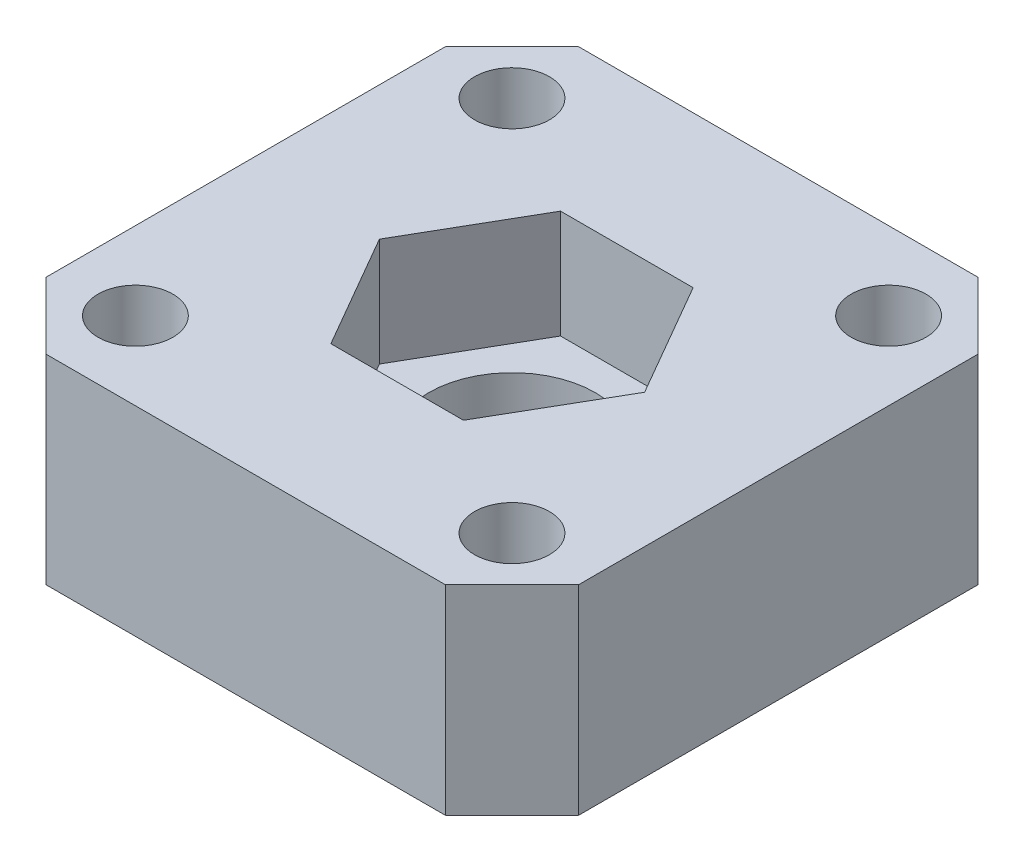
ISO-10303-21;
HEADER;
FILE_DESCRIPTION(('STEP AP214'),'2;1');
FILE_NAME('part.step','',(''),(''),'','','');
FILE_SCHEMA(('AUTOMOTIVE_DESIGN { 1 0 10303 214 1 1 1 1 }'));
ENDSEC;
DATA;
#1=APPLICATION_CONTEXT('core data for automotive mechanical design processes');
#2=APPLICATION_PROTOCOL_DEFINITION('international standard','automotive_design',2000,#1);
#3=PRODUCT_CONTEXT('',#1,'mechanical');
#4=PRODUCT('Part','Part','',(#3));
#5=PRODUCT_RELATED_PRODUCT_CATEGORY('part','',(#4));
#6=PRODUCT_DEFINITION_FORMATION('','',#4);
#7=PRODUCT_DEFINITION_CONTEXT('part definition',#1,'design');
#8=PRODUCT_DEFINITION('design','',#6,#7);
#9=PRODUCT_DEFINITION_SHAPE('','',#8);
#10=(LENGTH_UNIT() NAMED_UNIT(*) SI_UNIT(.MILLI.,.METRE.));
#11=(NAMED_UNIT(*) PLANE_ANGLE_UNIT() SI_UNIT($,.RADIAN.));
#12=(NAMED_UNIT(*) SI_UNIT($,.STERADIAN.) SOLID_ANGLE_UNIT());
#13=UNCERTAINTY_MEASURE_WITH_UNIT(LENGTH_MEASURE(1.E-05),#10,'distance_accuracy_value','');
#14=(GEOMETRIC_REPRESENTATION_CONTEXT(3) GLOBAL_UNCERTAINTY_ASSIGNED_CONTEXT((#13)) GLOBAL_UNIT_ASSIGNED_CONTEXT((#10,
#11,#12)) REPRESENTATION_CONTEXT('',''));
#15=CARTESIAN_POINT('',(0.,0.,0.));
#16=DIRECTION('',(0.,0.,1.));
#17=DIRECTION('',(1.,0.,0.));
#18=AXIS2_PLACEMENT_3D('',#15,#16,#17);
#19=CARTESIAN_POINT('',(0.,12.,0.));
#20=DIRECTION('',(0.,-1.,0.));
#21=DIRECTION('',(0.,0.,-1.));
#22=AXIS2_PLACEMENT_3D('',#19,#20,#21);
#23=CYLINDRICAL_SURFACE('',#22,5.);
#24=CARTESIAN_POINT('',(0.,0.,0.));
#25=DIRECTION('',(0.,1.,0.));
#26=DIRECTION('',(0.,0.,1.));
#27=AXIS2_PLACEMENT_3D('',#24,#25,#26);
#28=CIRCLE('',#27,5.);
#29=CARTESIAN_POINT('',(0.,0.,5.));
#30=VERTEX_POINT('',#29);
#31=EDGE_CURVE('E211',#30,#30,#28,.T.);
#32=ORIENTED_EDGE('',*,*,#31,.F.);
#33=EDGE_LOOP('',(#32));
#34=FACE_BOUND('',#33,.T.);
#35=CARTESIAN_POINT('',(0.,5.5,0.));
#36=DIRECTION('',(0.,1.,0.));
#37=DIRECTION('',(0.,0.,1.));
#38=AXIS2_PLACEMENT_3D('',#35,#36,#37);
#39=CIRCLE('',#38,5.);
#40=CARTESIAN_POINT('',(0.,5.5,5.));
#41=VERTEX_POINT('',#40);
#42=EDGE_CURVE('E36',#41,#41,#39,.T.);
#43=ORIENTED_EDGE('',*,*,#42,.T.);
#44=EDGE_LOOP('',(#43));
#45=FACE_BOUND('',#44,.T.);
#46=ADVANCED_FACE('F32',(#34,#45),#23,.F.);
#47=CARTESIAN_POINT('',(0.,12.,0.));
#48=DIRECTION('',(0.,1.,0.));
#49=DIRECTION('',(0.,0.,1.));
#50=AXIS2_PLACEMENT_3D('',#47,#48,#49);
#51=PLANE('',#50);
#52=DIRECTION('',(1.,0.,0.));
#53=VECTOR('',#52,1.);
#54=CARTESIAN_POINT('',(-3.98371685740842,12.,6.9));
#55=LINE('',#54,#53);
#56=CARTESIAN_POINT('',(-3.98371685740842,12.,6.9));
#57=VERTEX_POINT('',#56);
#58=CARTESIAN_POINT('',(3.98371685740842,12.,6.9));
#59=VERTEX_POINT('',#58);
#60=EDGE_CURVE('E48',#57,#59,#55,.T.);
#61=ORIENTED_EDGE('',*,*,#60,.F.);
#62=DIRECTION('',(0.5,0.,0.866025403784439));
#63=VECTOR('',#62,1.);
#64=CARTESIAN_POINT('',(-7.96743371481683,12.,0.));
#65=LINE('',#64,#63);
#66=CARTESIAN_POINT('',(-7.96743371481683,12.,0.));
#67=VERTEX_POINT('',#66);
#68=EDGE_CURVE('E156',#67,#57,#65,.T.);
#69=ORIENTED_EDGE('',*,*,#68,.F.);
#70=DIRECTION('',(-0.5,0.,0.866025403784439));
#71=VECTOR('',#70,1.);
#72=CARTESIAN_POINT('',(-3.98371685740842,12.,-6.9));
#73=LINE('',#72,#71);
#74=CARTESIAN_POINT('',(-3.98371685740842,12.,-6.9));
#75=VERTEX_POINT('',#74);
#76=EDGE_CURVE('E159',#75,#67,#73,.T.);
#77=ORIENTED_EDGE('',*,*,#76,.F.);
#78=DIRECTION('',(-1.,0.,0.));
#79=VECTOR('',#78,1.);
#80=CARTESIAN_POINT('',(3.98371685740842,12.,-6.9));
#81=LINE('',#80,#79);
#82=CARTESIAN_POINT('',(3.98371685740842,12.,-6.9));
#83=VERTEX_POINT('',#82);
#84=EDGE_CURVE('E175',#83,#75,#81,.T.);
#85=ORIENTED_EDGE('',*,*,#84,.F.);
#86=DIRECTION('',(-0.5,0.,-0.866025403784439));
#87=VECTOR('',#86,1.);
#88=CARTESIAN_POINT('',(7.96743371481684,12.,0.));
#89=LINE('',#88,#87);
#90=CARTESIAN_POINT('',(7.96743371481684,12.,0.));
#91=VERTEX_POINT('',#90);
#92=EDGE_CURVE('E172',#91,#83,#89,.T.);
#93=ORIENTED_EDGE('',*,*,#92,.F.);
#94=DIRECTION('',(0.5,0.,-0.866025403784439));
#95=VECTOR('',#94,1.);
#96=CARTESIAN_POINT('',(3.98371685740842,12.,6.9));
#97=LINE('',#96,#95);
#98=EDGE_CURVE('E170',#59,#91,#97,.T.);
#99=ORIENTED_EDGE('',*,*,#98,.F.);
#100=EDGE_LOOP('',(#61,#69,#77,#85,#93,#99));
#101=FACE_BOUND('',#100,.T.);
#102=CARTESIAN_POINT('',(11.3137084989848,12.,11.3137084989848));
#103=DIRECTION('',(0.,1.,0.));
#104=DIRECTION('',(0.,0.,1.));
#105=AXIS2_PLACEMENT_3D('',#102,#103,#104);
#106=CIRCLE('',#105,2.25);
#107=CARTESIAN_POINT('',(11.3137084989848,12.,13.5637084989848));
#108=VERTEX_POINT('',#107);
#109=EDGE_CURVE('E196',#108,#108,#106,.T.);
#110=ORIENTED_EDGE('',*,*,#109,.F.);
#111=EDGE_LOOP('',(#110));
#112=FACE_BOUND('',#111,.T.);
#113=CARTESIAN_POINT('',(-11.3137084989848,12.,-11.3137084989848));
#114=DIRECTION('',(0.,1.,0.));
#115=DIRECTION('',(0.,0.,1.));
#116=AXIS2_PLACEMENT_3D('',#113,#114,#115);
#117=CIRCLE('',#116,2.25);
#118=CARTESIAN_POINT('',(-11.3137084989848,12.,-9.06370849898476));
#119=VERTEX_POINT('',#118);
#120=EDGE_CURVE('E208',#119,#119,#117,.T.);
#121=ORIENTED_EDGE('',*,*,#120,.F.);
#122=EDGE_LOOP('',(#121));
#123=FACE_BOUND('',#122,.T.);
#124=DIRECTION('',(0.,0.,-1.));
#125=VECTOR('',#124,1.);
#126=CARTESIAN_POINT('',(16.,12.,-16.));
#127=LINE('',#126,#125);
#128=CARTESIAN_POINT('',(16.,12.,12.));
#129=VERTEX_POINT('',#128);
#130=CARTESIAN_POINT('',(16.,12.,-12.));
#131=VERTEX_POINT('',#130);
#132=EDGE_CURVE('E217',#129,#131,#127,.T.);
#133=ORIENTED_EDGE('',*,*,#132,.T.);
#134=DIRECTION('',(0.707106781186546,0.,0.707106781186549));
#135=VECTOR('',#134,1.);
#136=CARTESIAN_POINT('',(14.,12.,-14.));
#137=LINE('',#136,#135);
#138=CARTESIAN_POINT('',(12.,12.,-16.));
#139=VERTEX_POINT('',#138);
#140=EDGE_CURVE('E262',#131,#139,#137,.F.);
#141=ORIENTED_EDGE('',*,*,#140,.T.);
#142=DIRECTION('',(-1.,0.,0.));
#143=VECTOR('',#142,1.);
#144=CARTESIAN_POINT('',(-16.,12.,-16.));
#145=LINE('',#144,#143);
#146=CARTESIAN_POINT('',(-12.,12.,-16.));
#147=VERTEX_POINT('',#146);
#148=EDGE_CURVE('E220',#139,#147,#145,.T.);
#149=ORIENTED_EDGE('',*,*,#148,.T.);
#150=DIRECTION('',(0.707106781186549,0.,-0.707106781186546));
#151=VECTOR('',#150,1.);
#152=CARTESIAN_POINT('',(-14.,12.,-14.));
#153=LINE('',#152,#151);
#154=CARTESIAN_POINT('',(-16.,12.,-12.));
#155=VERTEX_POINT('',#154);
#156=EDGE_CURVE('E256',#147,#155,#153,.F.);
#157=ORIENTED_EDGE('',*,*,#156,.T.);
#158=DIRECTION('',(0.,0.,1.));
#159=VECTOR('',#158,1.);
#160=CARTESIAN_POINT('',(-16.,12.,-16.));
#161=LINE('',#160,#159);
#162=CARTESIAN_POINT('',(-16.,12.,12.));
#163=VERTEX_POINT('',#162);
#164=EDGE_CURVE('E224',#155,#163,#161,.T.);
#165=ORIENTED_EDGE('',*,*,#164,.T.);
#166=DIRECTION('',(-0.707106781186546,0.,-0.707106781186549));
#167=VECTOR('',#166,1.);
#168=CARTESIAN_POINT('',(-14.,12.,14.));
#169=LINE('',#168,#167);
#170=CARTESIAN_POINT('',(-12.,12.,16.));
#171=VERTEX_POINT('',#170);
#172=EDGE_CURVE('E258',#163,#171,#169,.F.);
#173=ORIENTED_EDGE('',*,*,#172,.T.);
#174=DIRECTION('',(1.,0.,0.));
#175=VECTOR('',#174,1.);
#176=CARTESIAN_POINT('',(-16.,12.,16.));
#177=LINE('',#176,#175);
#178=CARTESIAN_POINT('',(12.,12.,16.));
#179=VERTEX_POINT('',#178);
#180=EDGE_CURVE('E227',#171,#179,#177,.T.);
#181=ORIENTED_EDGE('',*,*,#180,.T.);
#182=DIRECTION('',(-0.707106781186549,0.,0.707106781186546));
#183=VECTOR('',#182,1.);
#184=CARTESIAN_POINT('',(14.,12.,14.));
#185=LINE('',#184,#183);
#186=EDGE_CURVE('E260',#179,#129,#185,.F.);
#187=ORIENTED_EDGE('',*,*,#186,.T.);
#188=EDGE_LOOP('',(#133,#141,#149,#157,#165,#173,#181,#187));
#189=FACE_BOUND('',#188,.T.);
#190=CARTESIAN_POINT('',(-11.3137084989848,12.,11.3137084989848));
#191=DIRECTION('',(0.,1.,0.));
#192=DIRECTION('',(0.,0.,1.));
#193=AXIS2_PLACEMENT_3D('',#190,#191,#192);
#194=CIRCLE('',#193,2.25);
#195=CARTESIAN_POINT('',(-11.3137084989848,12.,13.5637084989848));
#196=VERTEX_POINT('',#195);
#197=EDGE_CURVE('E202',#196,#196,#194,.T.);
#198=ORIENTED_EDGE('',*,*,#197,.F.);
#199=EDGE_LOOP('',(#198));
#200=FACE_BOUND('',#199,.T.);
#201=CARTESIAN_POINT('',(11.3137084989847,12.,-11.3137084989848));
#202=DIRECTION('',(0.,1.,0.));
#203=DIRECTION('',(0.,0.,1.));
#204=AXIS2_PLACEMENT_3D('',#201,#202,#203);
#205=CIRCLE('',#204,2.25);
#206=CARTESIAN_POINT('',(11.3137084989847,12.,-9.06370849898476));
#207=VERTEX_POINT('',#206);
#208=EDGE_CURVE('E189',#207,#207,#205,.T.);
#209=ORIENTED_EDGE('',*,*,#208,.F.);
#210=EDGE_LOOP('',(#209));
#211=FACE_BOUND('',#210,.T.);
#212=ADVANCED_FACE('F289',(#101,#112,#123,#189,#200,#211),#51,.T.);
#213=CARTESIAN_POINT('',(0.,0.,0.));
#214=DIRECTION('',(0.,1.,0.));
#215=DIRECTION('',(0.,0.,1.));
#216=AXIS2_PLACEMENT_3D('',#213,#214,#215);
#217=PLANE('',#216);
#218=DIRECTION('',(-1.,0.,0.));
#219=VECTOR('',#218,1.);
#220=CARTESIAN_POINT('',(-16.,0.,-16.));
#221=LINE('',#220,#219);
#222=CARTESIAN_POINT('',(12.,0.,-16.));
#223=VERTEX_POINT('',#222);
#224=CARTESIAN_POINT('',(-12.,0.,-16.));
#225=VERTEX_POINT('',#224);
#226=EDGE_CURVE('E232',#223,#225,#221,.T.);
#227=ORIENTED_EDGE('',*,*,#226,.F.);
#228=DIRECTION('',(-0.707106781186546,0.,-0.707106781186549));
#229=VECTOR('',#228,1.);
#230=CARTESIAN_POINT('',(12.,0.,-16.));
#231=LINE('',#230,#229);
#232=CARTESIAN_POINT('',(16.,0.,-12.));
#233=VERTEX_POINT('',#232);
#234=EDGE_CURVE('E249',#223,#233,#231,.F.);
#235=ORIENTED_EDGE('',*,*,#234,.T.);
#236=DIRECTION('',(0.,0.,-1.));
#237=VECTOR('',#236,1.);
#238=CARTESIAN_POINT('',(16.,0.,-16.));
#239=LINE('',#238,#237);
#240=CARTESIAN_POINT('',(16.,0.,12.));
#241=VERTEX_POINT('',#240);
#242=EDGE_CURVE('E216',#241,#233,#239,.T.);
#243=ORIENTED_EDGE('',*,*,#242,.F.);
#244=DIRECTION('',(0.707106781186549,0.,-0.707106781186546));
#245=VECTOR('',#244,1.);
#246=CARTESIAN_POINT('',(16.,0.,12.));
#247=LINE('',#246,#245);
#248=CARTESIAN_POINT('',(12.,0.,16.));
#249=VERTEX_POINT('',#248);
#250=EDGE_CURVE('E247',#241,#249,#247,.F.);
#251=ORIENTED_EDGE('',*,*,#250,.T.);
#252=DIRECTION('',(1.,0.,0.));
#253=VECTOR('',#252,1.);
#254=CARTESIAN_POINT('',(-16.,0.,16.));
#255=LINE('',#254,#253);
#256=CARTESIAN_POINT('',(-12.,0.,16.));
#257=VERTEX_POINT('',#256);
#258=EDGE_CURVE('E221',#257,#249,#255,.T.);
#259=ORIENTED_EDGE('',*,*,#258,.F.);
#260=DIRECTION('',(0.707106781186546,0.,0.707106781186549));
#261=VECTOR('',#260,1.);
#262=CARTESIAN_POINT('',(-12.,0.,16.));
#263=LINE('',#262,#261);
#264=CARTESIAN_POINT('',(-16.,0.,12.));
#265=VERTEX_POINT('',#264);
#266=EDGE_CURVE('E245',#257,#265,#263,.F.);
#267=ORIENTED_EDGE('',*,*,#266,.T.);
#268=DIRECTION('',(0.,0.,1.));
#269=VECTOR('',#268,1.);
#270=CARTESIAN_POINT('',(-16.,0.,-16.));
#271=LINE('',#270,#269);
#272=CARTESIAN_POINT('',(-16.,0.,-12.));
#273=VERTEX_POINT('',#272);
#274=EDGE_CURVE('E235',#273,#265,#271,.T.);
#275=ORIENTED_EDGE('',*,*,#274,.F.);
#276=DIRECTION('',(-0.707106781186549,0.,0.707106781186546));
#277=VECTOR('',#276,1.);
#278=CARTESIAN_POINT('',(-16.,0.,-12.));
#279=LINE('',#278,#277);
#280=EDGE_CURVE('E243',#273,#225,#279,.F.);
#281=ORIENTED_EDGE('',*,*,#280,.T.);
#282=EDGE_LOOP('',(#227,#235,#243,#251,#259,#267,#275,#281));
#283=FACE_BOUND('',#282,.T.);
#284=ORIENTED_EDGE('',*,*,#31,.T.);
#285=EDGE_LOOP('',(#284));
#286=FACE_BOUND('',#285,.T.);
#287=CARTESIAN_POINT('',(-11.3137084989848,0.,-11.3137084989848));
#288=DIRECTION('',(0.,1.,0.));
#289=DIRECTION('',(0.,0.,1.));
#290=AXIS2_PLACEMENT_3D('',#287,#288,#289);
#291=CIRCLE('',#290,2.25);
#292=CARTESIAN_POINT('',(-11.3137084989848,0.,-9.06370849898476));
#293=VERTEX_POINT('',#292);
#294=EDGE_CURVE('E205',#293,#293,#291,.T.);
#295=ORIENTED_EDGE('',*,*,#294,.T.);
#296=EDGE_LOOP('',(#295));
#297=FACE_BOUND('',#296,.T.);
#298=CARTESIAN_POINT('',(-11.3137084989848,0.,11.3137084989848));
#299=DIRECTION('',(0.,1.,0.));
#300=DIRECTION('',(0.,0.,1.));
#301=AXIS2_PLACEMENT_3D('',#298,#299,#300);
#302=CIRCLE('',#301,2.25);
#303=CARTESIAN_POINT('',(-11.3137084989848,0.,13.5637084989848));
#304=VERTEX_POINT('',#303);
#305=EDGE_CURVE('E199',#304,#304,#302,.T.);
#306=ORIENTED_EDGE('',*,*,#305,.T.);
#307=EDGE_LOOP('',(#306));
#308=FACE_BOUND('',#307,.T.);
#309=CARTESIAN_POINT('',(11.3137084989848,0.,11.3137084989848));
#310=DIRECTION('',(0.,1.,0.));
#311=DIRECTION('',(0.,0.,1.));
#312=AXIS2_PLACEMENT_3D('',#309,#310,#311);
#313=CIRCLE('',#312,2.25);
#314=CARTESIAN_POINT('',(11.3137084989848,0.,13.5637084989848));
#315=VERTEX_POINT('',#314);
#316=EDGE_CURVE('E192',#315,#315,#313,.T.);
#317=ORIENTED_EDGE('',*,*,#316,.T.);
#318=EDGE_LOOP('',(#317));
#319=FACE_BOUND('',#318,.T.);
#320=CARTESIAN_POINT('',(11.3137084989847,0.,-11.3137084989848));
#321=DIRECTION('',(0.,1.,0.));
#322=DIRECTION('',(0.,0.,1.));
#323=AXIS2_PLACEMENT_3D('',#320,#321,#322);
#324=CIRCLE('',#323,2.25);
#325=CARTESIAN_POINT('',(11.3137084989847,0.,-9.06370849898476));
#326=VERTEX_POINT('',#325);
#327=EDGE_CURVE('E193',#326,#326,#324,.T.);
#328=ORIENTED_EDGE('',*,*,#327,.T.);
#329=EDGE_LOOP('',(#328));
#330=FACE_BOUND('',#329,.T.);
#331=ADVANCED_FACE('F279',(#283,#286,#297,#308,#319,#330),#217,.F.);
#332=CARTESIAN_POINT('',(16.,12.,-16.));
#333=DIRECTION('',(-1.,0.,0.));
#334=DIRECTION('',(0.,0.,1.));
#335=AXIS2_PLACEMENT_3D('',#332,#333,#334);
#336=PLANE('',#335);
#337=ORIENTED_EDGE('',*,*,#242,.T.);
#338=DIRECTION('',(0.,1.,0.));
#339=VECTOR('',#338,1.);
#340=CARTESIAN_POINT('',(16.,12.,-12.));
#341=LINE('',#340,#339);
#342=EDGE_CURVE('E254',#233,#131,#341,.T.);
#343=ORIENTED_EDGE('',*,*,#342,.T.);
#344=ORIENTED_EDGE('',*,*,#132,.F.);
#345=DIRECTION('',(0.,-1.,0.));
#346=VECTOR('',#345,1.);
#347=CARTESIAN_POINT('',(16.,12.,12.));
#348=LINE('',#347,#346);
#349=EDGE_CURVE('E251',#129,#241,#348,.T.);
#350=ORIENTED_EDGE('',*,*,#349,.T.);
#351=EDGE_LOOP('',(#337,#343,#344,#350));
#352=FACE_BOUND('',#351,.T.);
#353=ADVANCED_FACE('F297',(#352),#336,.F.);
#354=CARTESIAN_POINT('',(-16.,12.,-16.));
#355=DIRECTION('',(0.,0.,1.));
#356=DIRECTION('',(1.,0.,0.));
#357=AXIS2_PLACEMENT_3D('',#354,#355,#356);
#358=PLANE('',#357);
#359=ORIENTED_EDGE('',*,*,#148,.F.);
#360=DIRECTION('',(0.,-1.,0.));
#361=VECTOR('',#360,1.);
#362=CARTESIAN_POINT('',(12.,12.,-16.));
#363=LINE('',#362,#361);
#364=EDGE_CURVE('E240',#139,#223,#363,.T.);
#365=ORIENTED_EDGE('',*,*,#364,.T.);
#366=ORIENTED_EDGE('',*,*,#226,.T.);
#367=DIRECTION('',(0.,1.,0.));
#368=VECTOR('',#367,1.);
#369=CARTESIAN_POINT('',(-12.,12.,-16.));
#370=LINE('',#369,#368);
#371=EDGE_CURVE('E229',#225,#147,#370,.T.);
#372=ORIENTED_EDGE('',*,*,#371,.T.);
#373=EDGE_LOOP('',(#359,#365,#366,#372));
#374=FACE_BOUND('',#373,.T.);
#375=ADVANCED_FACE('F305',(#374),#358,.F.);
#376=CARTESIAN_POINT('',(-16.,12.,-16.));
#377=DIRECTION('',(1.,0.,0.));
#378=DIRECTION('',(0.,0.,-1.));
#379=AXIS2_PLACEMENT_3D('',#376,#377,#378);
#380=PLANE('',#379);
#381=ORIENTED_EDGE('',*,*,#274,.T.);
#382=DIRECTION('',(0.,1.,0.));
#383=VECTOR('',#382,1.);
#384=CARTESIAN_POINT('',(-16.,12.,12.));
#385=LINE('',#384,#383);
#386=EDGE_CURVE('E11',#265,#163,#385,.T.);
#387=ORIENTED_EDGE('',*,*,#386,.T.);
#388=ORIENTED_EDGE('',*,*,#164,.F.);
#389=DIRECTION('',(0.,-1.,0.));
#390=VECTOR('',#389,1.);
#391=CARTESIAN_POINT('',(-16.,12.,-12.));
#392=LINE('',#391,#390);
#393=EDGE_CURVE('E41',#155,#273,#392,.T.);
#394=ORIENTED_EDGE('',*,*,#393,.T.);
#395=EDGE_LOOP('',(#381,#387,#388,#394));
#396=FACE_BOUND('',#395,.T.);
#397=ADVANCED_FACE('F273',(#396),#380,.F.);
#398=CARTESIAN_POINT('',(-16.,12.,16.));
#399=DIRECTION('',(0.,0.,-1.));
#400=DIRECTION('',(-1.,0.,0.));
#401=AXIS2_PLACEMENT_3D('',#398,#399,#400);
#402=PLANE('',#401);
#403=ORIENTED_EDGE('',*,*,#258,.T.);
#404=DIRECTION('',(0.,1.,0.));
#405=VECTOR('',#404,1.);
#406=CARTESIAN_POINT('',(12.,12.,16.));
#407=LINE('',#406,#405);
#408=EDGE_CURVE('E56',#249,#179,#407,.T.);
#409=ORIENTED_EDGE('',*,*,#408,.T.);
#410=ORIENTED_EDGE('',*,*,#180,.F.);
#411=DIRECTION('',(0.,-1.,0.));
#412=VECTOR('',#411,1.);
#413=CARTESIAN_POINT('',(-12.,12.,16.));
#414=LINE('',#413,#412);
#415=EDGE_CURVE('E264',#171,#257,#414,.T.);
#416=ORIENTED_EDGE('',*,*,#415,.T.);
#417=EDGE_LOOP('',(#403,#409,#410,#416));
#418=FACE_BOUND('',#417,.T.);
#419=ADVANCED_FACE('F286',(#418),#402,.F.);
#420=CARTESIAN_POINT('',(-11.3137084989848,12.,-11.3137084989848));
#421=DIRECTION('',(0.,-1.,0.));
#422=DIRECTION('',(0.,0.,-1.));
#423=AXIS2_PLACEMENT_3D('',#420,#421,#422);
#424=CYLINDRICAL_SURFACE('',#423,2.25);
#425=ORIENTED_EDGE('',*,*,#120,.T.);
#426=EDGE_LOOP('',(#425));
#427=FACE_BOUND('',#426,.T.);
#428=ORIENTED_EDGE('',*,*,#294,.F.);
#429=EDGE_LOOP('',(#428));
#430=FACE_BOUND('',#429,.T.);
#431=ADVANCED_FACE('F325',(#427,#430),#424,.F.);
#432=CARTESIAN_POINT('',(-11.3137084989848,12.,11.3137084989848));
#433=DIRECTION('',(0.,-1.,0.));
#434=DIRECTION('',(0.,0.,-1.));
#435=AXIS2_PLACEMENT_3D('',#432,#433,#434);
#436=CYLINDRICAL_SURFACE('',#435,2.25);
#437=ORIENTED_EDGE('',*,*,#197,.T.);
#438=EDGE_LOOP('',(#437));
#439=FACE_BOUND('',#438,.T.);
#440=ORIENTED_EDGE('',*,*,#305,.F.);
#441=EDGE_LOOP('',(#440));
#442=FACE_BOUND('',#441,.T.);
#443=ADVANCED_FACE('F438',(#439,#442),#436,.F.);
#444=CARTESIAN_POINT('',(11.3137084989848,12.,11.3137084989848));
#445=DIRECTION('',(0.,-1.,0.));
#446=DIRECTION('',(0.,0.,-1.));
#447=AXIS2_PLACEMENT_3D('',#444,#445,#446);
#448=CYLINDRICAL_SURFACE('',#447,2.25);
#449=ORIENTED_EDGE('',*,*,#109,.T.);
#450=EDGE_LOOP('',(#449));
#451=FACE_BOUND('',#450,.T.);
#452=ORIENTED_EDGE('',*,*,#316,.F.);
#453=EDGE_LOOP('',(#452));
#454=FACE_BOUND('',#453,.T.);
#455=ADVANCED_FACE('F435',(#451,#454),#448,.F.);
#456=CARTESIAN_POINT('',(11.3137084989847,12.,-11.3137084989848));
#457=DIRECTION('',(0.,-1.,0.));
#458=DIRECTION('',(0.,0.,-1.));
#459=AXIS2_PLACEMENT_3D('',#456,#457,#458);
#460=CYLINDRICAL_SURFACE('',#459,2.25);
#461=ORIENTED_EDGE('',*,*,#208,.T.);
#462=EDGE_LOOP('',(#461));
#463=FACE_BOUND('',#462,.T.);
#464=ORIENTED_EDGE('',*,*,#327,.F.);
#465=EDGE_LOOP('',(#464));
#466=FACE_BOUND('',#465,.T.);
#467=ADVANCED_FACE('F340',(#463,#466),#460,.F.);
#468=CARTESIAN_POINT('',(12.,12.,-16.));
#469=DIRECTION('',(-0.707106781186549,0.,0.707106781186546));
#470=DIRECTION('',(0.,-1.,0.));
#471=AXIS2_PLACEMENT_3D('',#468,#469,#470);
#472=PLANE('',#471);
#473=ORIENTED_EDGE('',*,*,#140,.F.);
#474=ORIENTED_EDGE('',*,*,#342,.F.);
#475=ORIENTED_EDGE('',*,*,#234,.F.);
#476=ORIENTED_EDGE('',*,*,#364,.F.);
#477=EDGE_LOOP('',(#473,#474,#475,#476));
#478=FACE_BOUND('',#477,.T.);
#479=ADVANCED_FACE('F302',(#478),#472,.F.);
#480=CARTESIAN_POINT('',(16.,12.,12.));
#481=DIRECTION('',(-0.707106781186546,0.,-0.707106781186549));
#482=DIRECTION('',(0.,-1.,0.));
#483=AXIS2_PLACEMENT_3D('',#480,#481,#482);
#484=PLANE('',#483);
#485=ORIENTED_EDGE('',*,*,#186,.F.);
#486=ORIENTED_EDGE('',*,*,#408,.F.);
#487=ORIENTED_EDGE('',*,*,#250,.F.);
#488=ORIENTED_EDGE('',*,*,#349,.F.);
#489=EDGE_LOOP('',(#485,#486,#487,#488));
#490=FACE_BOUND('',#489,.T.);
#491=ADVANCED_FACE('F294',(#490),#484,.F.);
#492=CARTESIAN_POINT('',(-12.,12.,16.));
#493=DIRECTION('',(0.707106781186549,0.,-0.707106781186546));
#494=DIRECTION('',(0.,-1.,0.));
#495=AXIS2_PLACEMENT_3D('',#492,#493,#494);
#496=PLANE('',#495);
#497=ORIENTED_EDGE('',*,*,#172,.F.);
#498=ORIENTED_EDGE('',*,*,#386,.F.);
#499=ORIENTED_EDGE('',*,*,#266,.F.);
#500=ORIENTED_EDGE('',*,*,#415,.F.);
#501=EDGE_LOOP('',(#497,#498,#499,#500));
#502=FACE_BOUND('',#501,.T.);
#503=ADVANCED_FACE('F285',(#502),#496,.F.);
#504=CARTESIAN_POINT('',(-16.,12.,-12.));
#505=DIRECTION('',(0.707106781186546,0.,0.707106781186549));
#506=DIRECTION('',(0.,-1.,0.));
#507=AXIS2_PLACEMENT_3D('',#504,#505,#506);
#508=PLANE('',#507);
#509=ORIENTED_EDGE('',*,*,#156,.F.);
#510=ORIENTED_EDGE('',*,*,#371,.F.);
#511=ORIENTED_EDGE('',*,*,#280,.F.);
#512=ORIENTED_EDGE('',*,*,#393,.F.);
#513=EDGE_LOOP('',(#509,#510,#511,#512));
#514=FACE_BOUND('',#513,.T.);
#515=ADVANCED_FACE('F34',(#514),#508,.F.);
#516=CARTESIAN_POINT('',(-3.98371685740842,5.5,6.9));
#517=DIRECTION('',(0.,0.,1.));
#518=DIRECTION('',(1.,0.,0.));
#519=AXIS2_PLACEMENT_3D('',#516,#517,#518);
#520=PLANE('',#519);
#521=ORIENTED_EDGE('',*,*,#60,.T.);
#522=DIRECTION('',(0.,1.,0.));
#523=VECTOR('',#522,1.);
#524=CARTESIAN_POINT('',(3.98371685740842,5.5,6.9));
#525=LINE('',#524,#523);
#526=CARTESIAN_POINT('',(3.98371685740842,5.5,6.9));
#527=VERTEX_POINT('',#526);
#528=EDGE_CURVE('E133',#527,#59,#525,.T.);
#529=ORIENTED_EDGE('',*,*,#528,.F.);
#530=DIRECTION('',(1.,0.,0.));
#531=VECTOR('',#530,1.);
#532=CARTESIAN_POINT('',(-3.98371685740842,5.5,6.9));
#533=LINE('',#532,#531);
#534=CARTESIAN_POINT('',(-3.98371685740842,5.5,6.9));
#535=VERTEX_POINT('',#534);
#536=EDGE_CURVE('E137',#535,#527,#533,.T.);
#537=ORIENTED_EDGE('',*,*,#536,.F.);
#538=DIRECTION('',(0.,1.,0.));
#539=VECTOR('',#538,1.);
#540=CARTESIAN_POINT('',(-3.98371685740842,5.5,6.9));
#541=LINE('',#540,#539);
#542=EDGE_CURVE('E180',#535,#57,#541,.T.);
#543=ORIENTED_EDGE('',*,*,#542,.T.);
#544=EDGE_LOOP('',(#521,#529,#537,#543));
#545=FACE_BOUND('',#544,.T.);
#546=ADVANCED_FACE('F135',(#545),#520,.F.);
#547=CARTESIAN_POINT('',(-7.96743371481683,5.5,0.));
#548=DIRECTION('',(-0.866025403784439,0.,0.5));
#549=DIRECTION('',(0.5,0.,0.866025403784439));
#550=AXIS2_PLACEMENT_3D('',#547,#548,#549);
#551=PLANE('',#550);
#552=ORIENTED_EDGE('',*,*,#68,.T.);
#553=ORIENTED_EDGE('',*,*,#542,.F.);
#554=DIRECTION('',(0.5,0.,0.866025403784439));
#555=VECTOR('',#554,1.);
#556=CARTESIAN_POINT('',(-7.96743371481683,5.5,0.));
#557=LINE('',#556,#555);
#558=CARTESIAN_POINT('',(-7.96743371481683,5.5,0.));
#559=VERTEX_POINT('',#558);
#560=EDGE_CURVE('E143',#559,#535,#557,.T.);
#561=ORIENTED_EDGE('',*,*,#560,.F.);
#562=DIRECTION('',(0.,1.,0.));
#563=VECTOR('',#562,1.);
#564=CARTESIAN_POINT('',(-7.96743371481683,5.5,0.));
#565=LINE('',#564,#563);
#566=EDGE_CURVE('E182',#559,#67,#565,.T.);
#567=ORIENTED_EDGE('',*,*,#566,.T.);
#568=EDGE_LOOP('',(#552,#553,#561,#567));
#569=FACE_BOUND('',#568,.T.);
#570=ADVANCED_FACE('F312',(#569),#551,.F.);
#571=CARTESIAN_POINT('',(-3.98371685740842,5.5,-6.9));
#572=DIRECTION('',(-0.866025403784439,0.,-0.5));
#573=DIRECTION('',(-0.5,0.,0.866025403784439));
#574=AXIS2_PLACEMENT_3D('',#571,#572,#573);
#575=PLANE('',#574);
#576=ORIENTED_EDGE('',*,*,#76,.T.);
#577=ORIENTED_EDGE('',*,*,#566,.F.);
#578=DIRECTION('',(-0.5,0.,0.866025403784439));
#579=VECTOR('',#578,1.);
#580=CARTESIAN_POINT('',(-3.98371685740842,5.5,-6.9));
#581=LINE('',#580,#579);
#582=CARTESIAN_POINT('',(-3.98371685740842,5.5,-6.9));
#583=VERTEX_POINT('',#582);
#584=EDGE_CURVE('E166',#583,#559,#581,.T.);
#585=ORIENTED_EDGE('',*,*,#584,.F.);
#586=DIRECTION('',(0.,1.,0.));
#587=VECTOR('',#586,1.);
#588=CARTESIAN_POINT('',(-3.98371685740842,5.5,-6.9));
#589=LINE('',#588,#587);
#590=EDGE_CURVE('E184',#583,#75,#589,.T.);
#591=ORIENTED_EDGE('',*,*,#590,.T.);
#592=EDGE_LOOP('',(#576,#577,#585,#591));
#593=FACE_BOUND('',#592,.T.);
#594=ADVANCED_FACE('F381',(#593),#575,.F.);
#595=CARTESIAN_POINT('',(3.98371685740842,5.5,-6.9));
#596=DIRECTION('',(0.,0.,-1.));
#597=DIRECTION('',(-1.,0.,0.));
#598=AXIS2_PLACEMENT_3D('',#595,#596,#597);
#599=PLANE('',#598);
#600=ORIENTED_EDGE('',*,*,#84,.T.);
#601=ORIENTED_EDGE('',*,*,#590,.F.);
#602=DIRECTION('',(-1.,0.,0.));
#603=VECTOR('',#602,1.);
#604=CARTESIAN_POINT('',(3.98371685740842,5.5,-6.9));
#605=LINE('',#604,#603);
#606=CARTESIAN_POINT('',(3.98371685740842,5.5,-6.9));
#607=VERTEX_POINT('',#606);
#608=EDGE_CURVE('E163',#607,#583,#605,.T.);
#609=ORIENTED_EDGE('',*,*,#608,.F.);
#610=DIRECTION('',(0.,1.,0.));
#611=VECTOR('',#610,1.);
#612=CARTESIAN_POINT('',(3.98371685740842,5.5,-6.9));
#613=LINE('',#612,#611);
#614=EDGE_CURVE('E186',#607,#83,#613,.T.);
#615=ORIENTED_EDGE('',*,*,#614,.T.);
#616=EDGE_LOOP('',(#600,#601,#609,#615));
#617=FACE_BOUND('',#616,.T.);
#618=ADVANCED_FACE('F391',(#617),#599,.F.);
#619=CARTESIAN_POINT('',(7.96743371481684,5.5,0.));
#620=DIRECTION('',(0.866025403784438,0.,-0.5));
#621=DIRECTION('',(-0.5,0.,-0.866025403784438));
#622=AXIS2_PLACEMENT_3D('',#619,#620,#621);
#623=PLANE('',#622);
#624=ORIENTED_EDGE('',*,*,#92,.T.);
#625=ORIENTED_EDGE('',*,*,#614,.F.);
#626=DIRECTION('',(-0.5,0.,-0.866025403784439));
#627=VECTOR('',#626,1.);
#628=CARTESIAN_POINT('',(7.96743371481684,5.5,0.));
#629=LINE('',#628,#627);
#630=CARTESIAN_POINT('',(7.96743371481684,5.5,0.));
#631=VERTEX_POINT('',#630);
#632=EDGE_CURVE('E151',#631,#607,#629,.T.);
#633=ORIENTED_EDGE('',*,*,#632,.F.);
#634=DIRECTION('',(0.,1.,0.));
#635=VECTOR('',#634,1.);
#636=CARTESIAN_POINT('',(7.96743371481684,5.5,0.));
#637=LINE('',#636,#635);
#638=EDGE_CURVE('E142',#631,#91,#637,.T.);
#639=ORIENTED_EDGE('',*,*,#638,.T.);
#640=EDGE_LOOP('',(#624,#625,#633,#639));
#641=FACE_BOUND('',#640,.T.);
#642=ADVANCED_FACE('F401',(#641),#623,.F.);
#643=CARTESIAN_POINT('',(3.98371685740842,5.5,6.9));
#644=DIRECTION('',(0.866025403784439,0.,0.5));
#645=DIRECTION('',(0.5,0.,-0.866025403784439));
#646=AXIS2_PLACEMENT_3D('',#643,#644,#645);
#647=PLANE('',#646);
#648=ORIENTED_EDGE('',*,*,#98,.T.);
#649=ORIENTED_EDGE('',*,*,#638,.F.);
#650=DIRECTION('',(0.5,0.,-0.866025403784439));
#651=VECTOR('',#650,1.);
#652=CARTESIAN_POINT('',(3.98371685740842,5.5,6.9));
#653=LINE('',#652,#651);
#654=EDGE_CURVE('E146',#527,#631,#653,.T.);
#655=ORIENTED_EDGE('',*,*,#654,.F.);
#656=ORIENTED_EDGE('',*,*,#528,.T.);
#657=EDGE_LOOP('',(#648,#649,#655,#656));
#658=FACE_BOUND('',#657,.T.);
#659=ADVANCED_FACE('F147',(#658),#647,.F.);
#660=CARTESIAN_POINT('',(0.,5.5,0.));
#661=DIRECTION('',(0.,1.,0.));
#662=DIRECTION('',(0.,0.,1.));
#663=AXIS2_PLACEMENT_3D('',#660,#661,#662);
#664=PLANE('',#663);
#665=ORIENTED_EDGE('',*,*,#42,.F.);
#666=EDGE_LOOP('',(#665));
#667=FACE_BOUND('',#666,.T.);
#668=ORIENTED_EDGE('',*,*,#536,.T.);
#669=ORIENTED_EDGE('',*,*,#654,.T.);
#670=ORIENTED_EDGE('',*,*,#632,.T.);
#671=ORIENTED_EDGE('',*,*,#608,.T.);
#672=ORIENTED_EDGE('',*,*,#584,.T.);
#673=ORIENTED_EDGE('',*,*,#560,.T.);
#674=EDGE_LOOP('',(#668,#669,#670,#671,#672,#673));
#675=FACE_BOUND('',#674,.T.);
#676=ADVANCED_FACE('F153',(#667,#675),#664,.T.);
#677=CLOSED_SHELL('',(#46,#212,#331,#353,#375,#397,#419,#431,#443,#455,#467,#479,#491,#503,#515,
#546,#570,#594,#618,#642,#659,#676));
#678=MANIFOLD_SOLID_BREP('B2',#677);
#679=ADVANCED_BREP_SHAPE_REPRESENTATION('',(#18,#678),#14);
#680=SHAPE_DEFINITION_REPRESENTATION(#9,#679);
ENDSEC;
END-ISO-10303-21;
